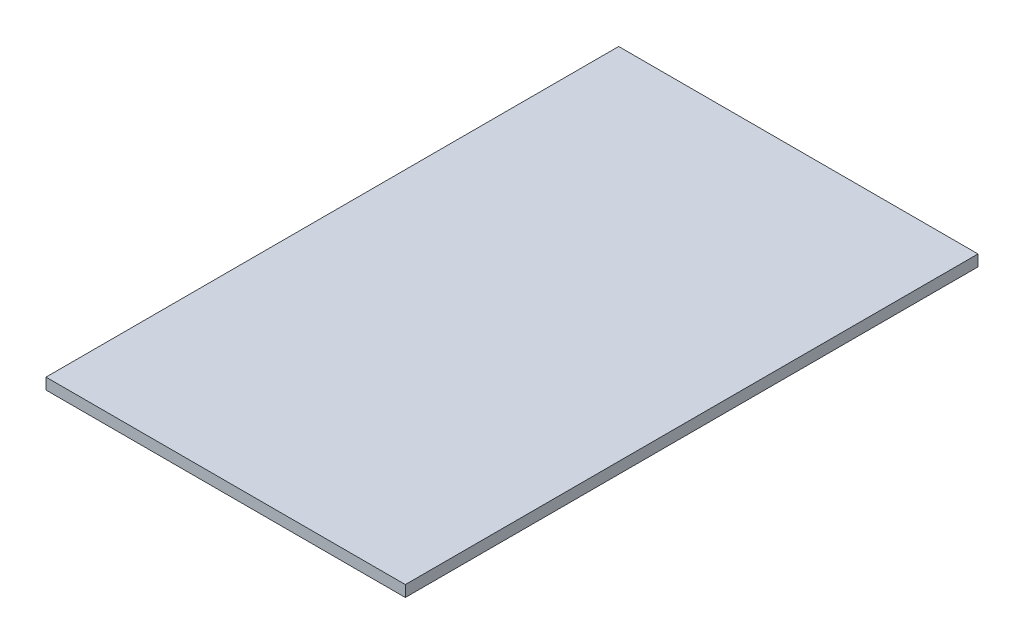
ISO-10303-21;
HEADER;
FILE_DESCRIPTION(('STEP AP214'),'2;1');
FILE_NAME('part.step','',(''),(''),'','','');
FILE_SCHEMA(('AUTOMOTIVE_DESIGN { 1 0 10303 214 1 1 1 1 }'));
ENDSEC;
DATA;
#1=APPLICATION_CONTEXT('core data for automotive mechanical design processes');
#2=APPLICATION_PROTOCOL_DEFINITION('international standard','automotive_design',2000,#1);
#3=PRODUCT_CONTEXT('',#1,'mechanical');
#4=PRODUCT('Part','Part','',(#3));
#5=PRODUCT_RELATED_PRODUCT_CATEGORY('part','',(#4));
#6=PRODUCT_DEFINITION_FORMATION('','',#4);
#7=PRODUCT_DEFINITION_CONTEXT('part definition',#1,'design');
#8=PRODUCT_DEFINITION('design','',#6,#7);
#9=PRODUCT_DEFINITION_SHAPE('','',#8);
#10=(LENGTH_UNIT() NAMED_UNIT(*) SI_UNIT(.MILLI.,.METRE.));
#11=(NAMED_UNIT(*) PLANE_ANGLE_UNIT() SI_UNIT($,.RADIAN.));
#12=(NAMED_UNIT(*) SI_UNIT($,.STERADIAN.) SOLID_ANGLE_UNIT());
#13=UNCERTAINTY_MEASURE_WITH_UNIT(LENGTH_MEASURE(1.E-05),#10,'distance_accuracy_value','');
#14=(GEOMETRIC_REPRESENTATION_CONTEXT(3) GLOBAL_UNCERTAINTY_ASSIGNED_CONTEXT((#13)) GLOBAL_UNIT_ASSIGNED_CONTEXT((#10,
#11,#12)) REPRESENTATION_CONTEXT('',''));
#15=CARTESIAN_POINT('',(0.,0.,0.));
#16=DIRECTION('',(0.,0.,1.));
#17=DIRECTION('',(1.,0.,0.));
#18=AXIS2_PLACEMENT_3D('',#15,#16,#17);
#19=CARTESIAN_POINT('',(-29.5014577952771,6.35,-280.445634352254));
#20=DIRECTION('',(1.,0.,0.));
#21=DIRECTION('',(0.,0.,-1.));
#22=AXIS2_PLACEMENT_3D('',#19,#20,#21);
#23=PLANE('',#22);
#24=DIRECTION('',(0.,0.,1.));
#25=VECTOR('',#24,1.);
#26=CARTESIAN_POINT('',(-29.5014577952771,0.,-280.445634352254));
#27=LINE('',#26,#25);
#28=CARTESIAN_POINT('',(-29.5014577952771,0.,-280.445634352254));
#29=VERTEX_POINT('',#28);
#30=CARTESIAN_POINT('',(-29.501457795277,0.,43.4043656477456));
#31=VERTEX_POINT('',#30);
#32=EDGE_CURVE('E96',#29,#31,#27,.T.);
#33=ORIENTED_EDGE('',*,*,#32,.T.);
#34=DIRECTION('',(0.,-1.,0.));
#35=VECTOR('',#34,1.);
#36=CARTESIAN_POINT('',(-29.501457795277,6.35,43.4043656477456));
#37=LINE('',#36,#35);
#38=CARTESIAN_POINT('',(-29.501457795277,6.35,43.4043656477456));
#39=VERTEX_POINT('',#38);
#40=EDGE_CURVE('E11',#39,#31,#37,.T.);
#41=ORIENTED_EDGE('',*,*,#40,.F.);
#42=DIRECTION('',(0.,0.,1.));
#43=VECTOR('',#42,1.);
#44=CARTESIAN_POINT('',(-29.5014577952771,6.35,-280.445634352254));
#45=LINE('',#44,#43);
#46=CARTESIAN_POINT('',(-29.5014577952771,6.35,-280.445634352254));
#47=VERTEX_POINT('',#46);
#48=EDGE_CURVE('E84',#47,#39,#45,.T.);
#49=ORIENTED_EDGE('',*,*,#48,.F.);
#50=DIRECTION('',(0.,-1.,0.));
#51=VECTOR('',#50,1.);
#52=CARTESIAN_POINT('',(-29.5014577952771,6.35,-280.445634352254));
#53=LINE('',#52,#51);
#54=EDGE_CURVE('E92',#47,#29,#53,.T.);
#55=ORIENTED_EDGE('',*,*,#54,.T.);
#56=EDGE_LOOP('',(#33,#41,#49,#55));
#57=FACE_BOUND('',#56,.T.);
#58=ADVANCED_FACE('F33',(#57),#23,.F.);
#59=CARTESIAN_POINT('',(-29.501457795277,6.35,43.4043656477456));
#60=DIRECTION('',(0.,0.,-1.));
#61=DIRECTION('',(-1.,0.,0.));
#62=AXIS2_PLACEMENT_3D('',#59,#60,#61);
#63=PLANE('',#62);
#64=DIRECTION('',(1.,0.,0.));
#65=VECTOR('',#64,1.);
#66=CARTESIAN_POINT('',(-29.501457795277,0.,43.4043656477456));
#67=LINE('',#66,#65);
#68=CARTESIAN_POINT('',(173.698542204723,0.,43.4043656477456));
#69=VERTEX_POINT('',#68);
#70=EDGE_CURVE('E88',#31,#69,#67,.T.);
#71=ORIENTED_EDGE('',*,*,#70,.T.);
#72=DIRECTION('',(0.,-1.,0.));
#73=VECTOR('',#72,1.);
#74=CARTESIAN_POINT('',(173.698542204723,6.35,43.4043656477456));
#75=LINE('',#74,#73);
#76=CARTESIAN_POINT('',(173.698542204723,6.35,43.4043656477456));
#77=VERTEX_POINT('',#76);
#78=EDGE_CURVE('E41',#77,#69,#75,.T.);
#79=ORIENTED_EDGE('',*,*,#78,.F.);
#80=DIRECTION('',(1.,0.,0.));
#81=VECTOR('',#80,1.);
#82=CARTESIAN_POINT('',(-29.501457795277,6.35,43.4043656477456));
#83=LINE('',#82,#81);
#84=EDGE_CURVE('E79',#39,#77,#83,.T.);
#85=ORIENTED_EDGE('',*,*,#84,.F.);
#86=ORIENTED_EDGE('',*,*,#40,.T.);
#87=EDGE_LOOP('',(#71,#79,#85,#86));
#88=FACE_BOUND('',#87,.T.);
#89=ADVANCED_FACE('F87',(#88),#63,.F.);
#90=CARTESIAN_POINT('',(173.698542204723,6.35,-280.445634352254));
#91=DIRECTION('',(-1.,0.,0.));
#92=DIRECTION('',(0.,0.,1.));
#93=AXIS2_PLACEMENT_3D('',#90,#91,#92);
#94=PLANE('',#93);
#95=DIRECTION('',(0.,0.,-1.));
#96=VECTOR('',#95,1.);
#97=CARTESIAN_POINT('',(173.698542204723,0.,-280.445634352254));
#98=LINE('',#97,#96);
#99=CARTESIAN_POINT('',(173.698542204723,0.,-280.445634352254));
#100=VERTEX_POINT('',#99);
#101=EDGE_CURVE('E66',#69,#100,#98,.T.);
#102=ORIENTED_EDGE('',*,*,#101,.T.);
#103=DIRECTION('',(0.,-1.,0.));
#104=VECTOR('',#103,1.);
#105=CARTESIAN_POINT('',(173.698542204723,6.35,-280.445634352254));
#106=LINE('',#105,#104);
#107=CARTESIAN_POINT('',(173.698542204723,6.35,-280.445634352254));
#108=VERTEX_POINT('',#107);
#109=EDGE_CURVE('E89',#108,#100,#106,.T.);
#110=ORIENTED_EDGE('',*,*,#109,.F.);
#111=DIRECTION('',(0.,0.,-1.));
#112=VECTOR('',#111,1.);
#113=CARTESIAN_POINT('',(173.698542204723,6.35,-280.445634352254));
#114=LINE('',#113,#112);
#115=EDGE_CURVE('E82',#77,#108,#114,.T.);
#116=ORIENTED_EDGE('',*,*,#115,.F.);
#117=ORIENTED_EDGE('',*,*,#78,.T.);
#118=EDGE_LOOP('',(#102,#110,#116,#117));
#119=FACE_BOUND('',#118,.T.);
#120=ADVANCED_FACE('F90',(#119),#94,.F.);
#121=CARTESIAN_POINT('',(-29.5014577952771,6.35,-280.445634352254));
#122=DIRECTION('',(0.,0.,1.));
#123=DIRECTION('',(1.,0.,0.));
#124=AXIS2_PLACEMENT_3D('',#121,#122,#123);
#125=PLANE('',#124);
#126=DIRECTION('',(-1.,0.,0.));
#127=VECTOR('',#126,1.);
#128=CARTESIAN_POINT('',(-29.5014577952771,0.,-280.445634352254));
#129=LINE('',#128,#127);
#130=EDGE_CURVE('E72',#100,#29,#129,.T.);
#131=ORIENTED_EDGE('',*,*,#130,.T.);
#132=ORIENTED_EDGE('',*,*,#54,.F.);
#133=DIRECTION('',(-1.,0.,0.));
#134=VECTOR('',#133,1.);
#135=CARTESIAN_POINT('',(-29.5014577952771,6.35,-280.445634352254));
#136=LINE('',#135,#134);
#137=EDGE_CURVE('E49',#108,#47,#136,.T.);
#138=ORIENTED_EDGE('',*,*,#137,.F.);
#139=ORIENTED_EDGE('',*,*,#109,.T.);
#140=EDGE_LOOP('',(#131,#132,#138,#139));
#141=FACE_BOUND('',#140,.T.);
#142=ADVANCED_FACE('F103',(#141),#125,.F.);
#143=CARTESIAN_POINT('',(0.,6.35,0.));
#144=DIRECTION('',(0.,1.,0.));
#145=DIRECTION('',(0.,0.,1.));
#146=AXIS2_PLACEMENT_3D('',#143,#144,#145);
#147=PLANE('',#146);
#148=ORIENTED_EDGE('',*,*,#48,.T.);
#149=ORIENTED_EDGE('',*,*,#84,.T.);
#150=ORIENTED_EDGE('',*,*,#115,.T.);
#151=ORIENTED_EDGE('',*,*,#137,.T.);
#152=EDGE_LOOP('',(#148,#149,#150,#151));
#153=FACE_BOUND('',#152,.T.);
#154=ADVANCED_FACE('F80',(#153),#147,.T.);
#155=CARTESIAN_POINT('',(0.,0.,0.));
#156=DIRECTION('',(0.,1.,0.));
#157=DIRECTION('',(0.,0.,1.));
#158=AXIS2_PLACEMENT_3D('',#155,#156,#157);
#159=PLANE('',#158);
#160=ORIENTED_EDGE('',*,*,#32,.F.);
#161=ORIENTED_EDGE('',*,*,#130,.F.);
#162=ORIENTED_EDGE('',*,*,#101,.F.);
#163=ORIENTED_EDGE('',*,*,#70,.F.);
#164=EDGE_LOOP('',(#160,#161,#162,#163));
#165=FACE_BOUND('',#164,.T.);
#166=ADVANCED_FACE('F106',(#165),#159,.F.);
#167=CLOSED_SHELL('',(#58,#89,#120,#142,#154,#166));
#168=MANIFOLD_SOLID_BREP('B2',#167);
#169=ADVANCED_BREP_SHAPE_REPRESENTATION('',(#18,#168),#14);
#170=SHAPE_DEFINITION_REPRESENTATION(#9,#169);
ENDSEC;
END-ISO-10303-21;
